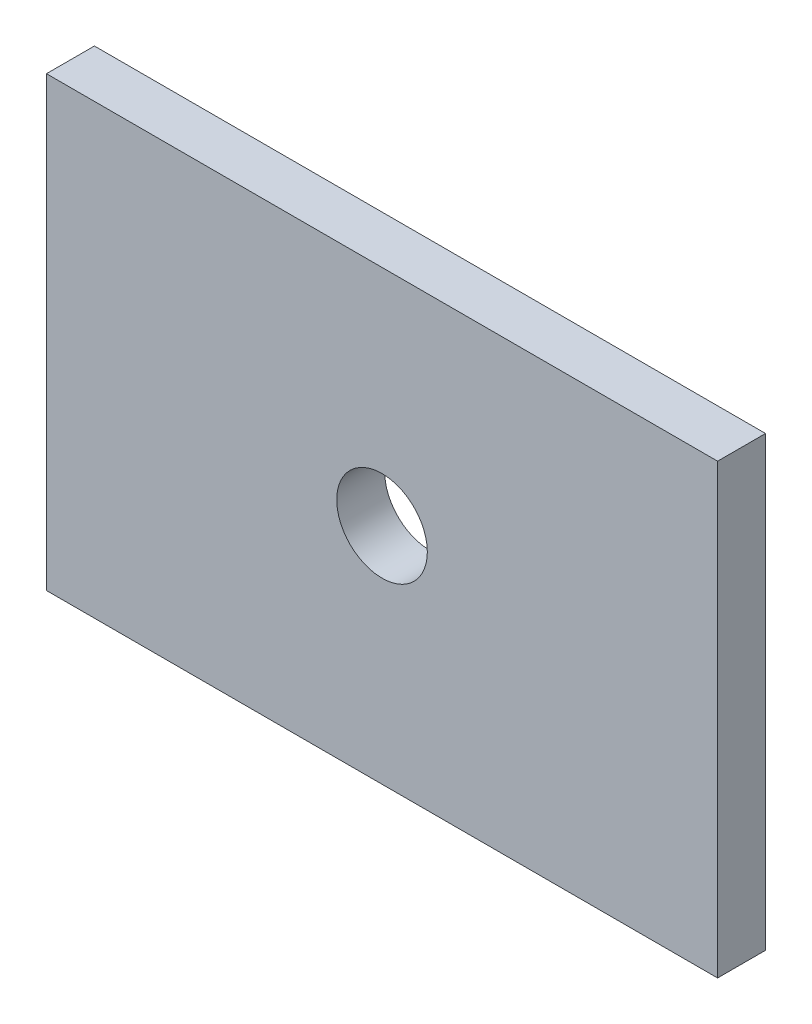
ISO-10303-21;
HEADER;
FILE_DESCRIPTION(('STEP AP214'),'2;1');
FILE_NAME('part.step','',(''),(''),'','','');
FILE_SCHEMA(('AUTOMOTIVE_DESIGN { 1 0 10303 214 1 1 1 1 }'));
ENDSEC;
DATA;
#1=APPLICATION_CONTEXT('core data for automotive mechanical design processes');
#2=APPLICATION_PROTOCOL_DEFINITION('international standard','automotive_design',2000,#1);
#3=PRODUCT_CONTEXT('',#1,'mechanical');
#4=PRODUCT('Part','Part','',(#3));
#5=PRODUCT_RELATED_PRODUCT_CATEGORY('part','',(#4));
#6=PRODUCT_DEFINITION_FORMATION('','',#4);
#7=PRODUCT_DEFINITION_CONTEXT('part definition',#1,'design');
#8=PRODUCT_DEFINITION('design','',#6,#7);
#9=PRODUCT_DEFINITION_SHAPE('','',#8);
#10=(LENGTH_UNIT() NAMED_UNIT(*) SI_UNIT(.MILLI.,.METRE.));
#11=(NAMED_UNIT(*) PLANE_ANGLE_UNIT() SI_UNIT($,.RADIAN.));
#12=(NAMED_UNIT(*) SI_UNIT($,.STERADIAN.) SOLID_ANGLE_UNIT());
#13=UNCERTAINTY_MEASURE_WITH_UNIT(LENGTH_MEASURE(1.E-05),#10,'distance_accuracy_value','');
#14=(GEOMETRIC_REPRESENTATION_CONTEXT(3) GLOBAL_UNCERTAINTY_ASSIGNED_CONTEXT((#13)) GLOBAL_UNIT_ASSIGNED_CONTEXT((#10,
#11,#12)) REPRESENTATION_CONTEXT('',''));
#15=CARTESIAN_POINT('',(0.,0.,0.));
#16=DIRECTION('',(0.,0.,1.));
#17=DIRECTION('',(1.,0.,0.));
#18=AXIS2_PLACEMENT_3D('',#15,#16,#17);
#19=CARTESIAN_POINT('',(0.,0.,4.7625));
#20=DIRECTION('',(1.,0.,0.));
#21=DIRECTION('',(0.,0.,-1.));
#22=AXIS2_PLACEMENT_3D('',#19,#20,#21);
#23=PLANE('',#22);
#24=DIRECTION('',(0.,-1.,0.));
#25=VECTOR('',#24,1.);
#26=CARTESIAN_POINT('',(0.,0.,0.));
#27=LINE('',#26,#25);
#28=CARTESIAN_POINT('',(0.,44.45,0.));
#29=VERTEX_POINT('',#28);
#30=CARTESIAN_POINT('',(0.,0.,0.));
#31=VERTEX_POINT('',#30);
#32=EDGE_CURVE('E98',#29,#31,#27,.T.);
#33=ORIENTED_EDGE('',*,*,#32,.T.);
#34=DIRECTION('',(0.,0.,-1.));
#35=VECTOR('',#34,1.);
#36=CARTESIAN_POINT('',(0.,0.,4.7625));
#37=LINE('',#36,#35);
#38=CARTESIAN_POINT('',(0.,0.,4.7625));
#39=VERTEX_POINT('',#38);
#40=EDGE_CURVE('E11',#39,#31,#37,.T.);
#41=ORIENTED_EDGE('',*,*,#40,.F.);
#42=DIRECTION('',(0.,-1.,0.));
#43=VECTOR('',#42,1.);
#44=CARTESIAN_POINT('',(0.,0.,4.7625));
#45=LINE('',#44,#43);
#46=CARTESIAN_POINT('',(0.,44.45,4.7625));
#47=VERTEX_POINT('',#46);
#48=EDGE_CURVE('E86',#47,#39,#45,.T.);
#49=ORIENTED_EDGE('',*,*,#48,.F.);
#50=DIRECTION('',(0.,0.,-1.));
#51=VECTOR('',#50,1.);
#52=CARTESIAN_POINT('',(0.,44.45,4.7625));
#53=LINE('',#52,#51);
#54=EDGE_CURVE('E94',#47,#29,#53,.T.);
#55=ORIENTED_EDGE('',*,*,#54,.T.);
#56=EDGE_LOOP('',(#33,#41,#49,#55));
#57=FACE_BOUND('',#56,.T.);
#58=ADVANCED_FACE('F35',(#57),#23,.F.);
#59=CARTESIAN_POINT('',(0.,0.,4.7625));
#60=DIRECTION('',(0.,1.,0.));
#61=DIRECTION('',(0.,0.,1.));
#62=AXIS2_PLACEMENT_3D('',#59,#60,#61);
#63=PLANE('',#62);
#64=DIRECTION('',(1.,0.,0.));
#65=VECTOR('',#64,1.);
#66=CARTESIAN_POINT('',(0.,0.,0.));
#67=LINE('',#66,#65);
#68=CARTESIAN_POINT('',(66.6496,0.,0.));
#69=VERTEX_POINT('',#68);
#70=EDGE_CURVE('E90',#31,#69,#67,.T.);
#71=ORIENTED_EDGE('',*,*,#70,.T.);
#72=DIRECTION('',(0.,0.,-1.));
#73=VECTOR('',#72,1.);
#74=CARTESIAN_POINT('',(66.6496,0.,4.7625));
#75=LINE('',#74,#73);
#76=CARTESIAN_POINT('',(66.6496,0.,4.7625));
#77=VERTEX_POINT('',#76);
#78=EDGE_CURVE('E43',#77,#69,#75,.T.);
#79=ORIENTED_EDGE('',*,*,#78,.F.);
#80=DIRECTION('',(1.,0.,0.));
#81=VECTOR('',#80,1.);
#82=CARTESIAN_POINT('',(0.,0.,4.7625));
#83=LINE('',#82,#81);
#84=EDGE_CURVE('E81',#39,#77,#83,.T.);
#85=ORIENTED_EDGE('',*,*,#84,.F.);
#86=ORIENTED_EDGE('',*,*,#40,.T.);
#87=EDGE_LOOP('',(#71,#79,#85,#86));
#88=FACE_BOUND('',#87,.T.);
#89=ADVANCED_FACE('F89',(#88),#63,.F.);
#90=CARTESIAN_POINT('',(66.6496,0.,4.7625));
#91=DIRECTION('',(-1.,0.,0.));
#92=DIRECTION('',(0.,0.,1.));
#93=AXIS2_PLACEMENT_3D('',#90,#91,#92);
#94=PLANE('',#93);
#95=DIRECTION('',(0.,1.,0.));
#96=VECTOR('',#95,1.);
#97=CARTESIAN_POINT('',(66.6496,0.,0.));
#98=LINE('',#97,#96);
#99=CARTESIAN_POINT('',(66.6496,44.45,0.));
#100=VERTEX_POINT('',#99);
#101=EDGE_CURVE('E68',#69,#100,#98,.T.);
#102=ORIENTED_EDGE('',*,*,#101,.T.);
#103=DIRECTION('',(0.,0.,-1.));
#104=VECTOR('',#103,1.);
#105=CARTESIAN_POINT('',(66.6496,44.45,4.7625));
#106=LINE('',#105,#104);
#107=CARTESIAN_POINT('',(66.6496,44.45,4.7625));
#108=VERTEX_POINT('',#107);
#109=EDGE_CURVE('E91',#108,#100,#106,.T.);
#110=ORIENTED_EDGE('',*,*,#109,.F.);
#111=DIRECTION('',(0.,1.,0.));
#112=VECTOR('',#111,1.);
#113=CARTESIAN_POINT('',(66.6496,0.,4.7625));
#114=LINE('',#113,#112);
#115=EDGE_CURVE('E84',#77,#108,#114,.T.);
#116=ORIENTED_EDGE('',*,*,#115,.F.);
#117=ORIENTED_EDGE('',*,*,#78,.T.);
#118=EDGE_LOOP('',(#102,#110,#116,#117));
#119=FACE_BOUND('',#118,.T.);
#120=ADVANCED_FACE('F92',(#119),#94,.F.);
#121=CARTESIAN_POINT('',(0.,44.45,4.7625));
#122=DIRECTION('',(0.,-1.,0.));
#123=DIRECTION('',(0.,0.,-1.));
#124=AXIS2_PLACEMENT_3D('',#121,#122,#123);
#125=PLANE('',#124);
#126=DIRECTION('',(-1.,0.,0.));
#127=VECTOR('',#126,1.);
#128=CARTESIAN_POINT('',(0.,44.45,0.));
#129=LINE('',#128,#127);
#130=EDGE_CURVE('E74',#100,#29,#129,.T.);
#131=ORIENTED_EDGE('',*,*,#130,.T.);
#132=ORIENTED_EDGE('',*,*,#54,.F.);
#133=DIRECTION('',(-1.,0.,0.));
#134=VECTOR('',#133,1.);
#135=CARTESIAN_POINT('',(0.,44.45,4.7625));
#136=LINE('',#135,#134);
#137=EDGE_CURVE('E51',#108,#47,#136,.T.);
#138=ORIENTED_EDGE('',*,*,#137,.F.);
#139=ORIENTED_EDGE('',*,*,#109,.T.);
#140=EDGE_LOOP('',(#131,#132,#138,#139));
#141=FACE_BOUND('',#140,.T.);
#142=ADVANCED_FACE('F106',(#141),#125,.F.);
#143=CARTESIAN_POINT('',(0.,0.,4.7625));
#144=DIRECTION('',(0.,0.,-1.));
#145=DIRECTION('',(-1.,0.,0.));
#146=AXIS2_PLACEMENT_3D('',#143,#144,#145);
#147=PLANE('',#146);
#148=CARTESIAN_POINT('',(33.3248,22.225,4.7625));
#149=DIRECTION('',(0.,0.,1.));
#150=DIRECTION('',(1.,0.,0.));
#151=AXIS2_PLACEMENT_3D('',#148,#149,#150);
#152=CIRCLE('',#151,4.5);
#153=CARTESIAN_POINT('',(37.8248,22.225,4.7625));
#154=VERTEX_POINT('',#153);
#155=EDGE_CURVE('E112',#154,#154,#152,.T.);
#156=ORIENTED_EDGE('',*,*,#155,.F.);
#157=EDGE_LOOP('',(#156));
#158=FACE_BOUND('',#157,.T.);
#159=ORIENTED_EDGE('',*,*,#48,.T.);
#160=ORIENTED_EDGE('',*,*,#84,.T.);
#161=ORIENTED_EDGE('',*,*,#115,.T.);
#162=ORIENTED_EDGE('',*,*,#137,.T.);
#163=EDGE_LOOP('',(#159,#160,#161,#162));
#164=FACE_BOUND('',#163,.T.);
#165=ADVANCED_FACE('F82',(#158,#164),#147,.F.);
#166=CARTESIAN_POINT('',(0.,0.,0.));
#167=DIRECTION('',(0.,0.,-1.));
#168=DIRECTION('',(-1.,0.,0.));
#169=AXIS2_PLACEMENT_3D('',#166,#167,#168);
#170=PLANE('',#169);
#171=CARTESIAN_POINT('',(33.3248,22.225,0.));
#172=DIRECTION('',(0.,0.,1.));
#173=DIRECTION('',(1.,0.,0.));
#174=AXIS2_PLACEMENT_3D('',#171,#172,#173);
#175=CIRCLE('',#174,4.5);
#176=CARTESIAN_POINT('',(37.8248,22.225,0.));
#177=VERTEX_POINT('',#176);
#178=EDGE_CURVE('E101',#177,#177,#175,.T.);
#179=ORIENTED_EDGE('',*,*,#178,.T.);
#180=EDGE_LOOP('',(#179));
#181=FACE_BOUND('',#180,.T.);
#182=ORIENTED_EDGE('',*,*,#32,.F.);
#183=ORIENTED_EDGE('',*,*,#130,.F.);
#184=ORIENTED_EDGE('',*,*,#101,.F.);
#185=ORIENTED_EDGE('',*,*,#70,.F.);
#186=EDGE_LOOP('',(#182,#183,#184,#185));
#187=FACE_BOUND('',#186,.T.);
#188=ADVANCED_FACE('F109',(#181,#187),#170,.T.);
#189=CARTESIAN_POINT('',(33.3248,22.225,0.));
#190=DIRECTION('',(0.,0.,1.));
#191=DIRECTION('',(1.,0.,0.));
#192=AXIS2_PLACEMENT_3D('',#189,#190,#191);
#193=CYLINDRICAL_SURFACE('',#192,4.5);
#194=CARTESIAN_POINT('',(37.8248,22.225,0.));
#195=CARTESIAN_POINT('',(37.8248,22.225,0.049609375));
#196=CARTESIAN_POINT('',(37.8248,22.225,0.09921875));
#197=CARTESIAN_POINT('',(37.8248,22.225,0.1984375));
#198=CARTESIAN_POINT('',(37.8248,22.225,0.248046875));
#199=CARTESIAN_POINT('',(37.8248,22.225,0.347265625));
#200=CARTESIAN_POINT('',(37.8248,22.225,0.396875));
#201=CARTESIAN_POINT('',(37.8248,22.225,0.49609375));
#202=CARTESIAN_POINT('',(37.8248,22.225,0.545703125));
#203=CARTESIAN_POINT('',(37.8248,22.225,0.644921875));
#204=CARTESIAN_POINT('',(37.8248,22.225,0.69453125));
#205=CARTESIAN_POINT('',(37.8248,22.225,0.79375));
#206=CARTESIAN_POINT('',(37.8248,22.225,0.843359375));
#207=CARTESIAN_POINT('',(37.8248,22.225,0.942578125));
#208=CARTESIAN_POINT('',(37.8248,22.225,0.9921875));
#209=CARTESIAN_POINT('',(37.8248,22.225,1.09140625));
#210=CARTESIAN_POINT('',(37.8248,22.225,1.141015625));
#211=CARTESIAN_POINT('',(37.8248,22.225,1.240234375));
#212=CARTESIAN_POINT('',(37.8248,22.225,1.28984375));
#213=CARTESIAN_POINT('',(37.8248,22.225,1.3890625));
#214=CARTESIAN_POINT('',(37.8248,22.225,1.438671875));
#215=CARTESIAN_POINT('',(37.8248,22.225,1.537890625));
#216=CARTESIAN_POINT('',(37.8248,22.225,1.5875));
#217=CARTESIAN_POINT('',(37.8248,22.225,1.68671875));
#218=CARTESIAN_POINT('',(37.8248,22.225,1.736328125));
#219=CARTESIAN_POINT('',(37.8248,22.225,1.835546875));
#220=CARTESIAN_POINT('',(37.8248,22.225,1.88515625));
#221=CARTESIAN_POINT('',(37.8248,22.225,1.984375));
#222=CARTESIAN_POINT('',(37.8248,22.225,2.033984375));
#223=CARTESIAN_POINT('',(37.8248,22.225,2.133203125));
#224=CARTESIAN_POINT('',(37.8248,22.225,2.1828125));
#225=CARTESIAN_POINT('',(37.8248,22.225,2.28203125));
#226=CARTESIAN_POINT('',(37.8248,22.225,2.331640625));
#227=CARTESIAN_POINT('',(37.8248,22.225,2.430859375));
#228=CARTESIAN_POINT('',(37.8248,22.225,2.48046875));
#229=CARTESIAN_POINT('',(37.8248,22.225,2.5796875));
#230=CARTESIAN_POINT('',(37.8248,22.225,2.629296875));
#231=CARTESIAN_POINT('',(37.8248,22.225,2.728515625));
#232=CARTESIAN_POINT('',(37.8248,22.225,2.778125));
#233=CARTESIAN_POINT('',(37.8248,22.225,2.87734375));
#234=CARTESIAN_POINT('',(37.8248,22.225,2.926953125));
#235=CARTESIAN_POINT('',(37.8248,22.225,3.026171875));
#236=CARTESIAN_POINT('',(37.8248,22.225,3.07578125));
#237=CARTESIAN_POINT('',(37.8248,22.225,3.175));
#238=CARTESIAN_POINT('',(37.8248,22.225,3.224609375));
#239=CARTESIAN_POINT('',(37.8248,22.225,3.323828125));
#240=CARTESIAN_POINT('',(37.8248,22.225,3.3734375));
#241=CARTESIAN_POINT('',(37.8248,22.225,3.47265625));
#242=CARTESIAN_POINT('',(37.8248,22.225,3.522265625));
#243=CARTESIAN_POINT('',(37.8248,22.225,3.621484375));
#244=CARTESIAN_POINT('',(37.8248,22.225,3.67109375));
#245=CARTESIAN_POINT('',(37.8248,22.225,3.7703125));
#246=CARTESIAN_POINT('',(37.8248,22.225,3.819921875));
#247=CARTESIAN_POINT('',(37.8248,22.225,3.919140625));
#248=CARTESIAN_POINT('',(37.8248,22.225,3.96875));
#249=CARTESIAN_POINT('',(37.8248,22.225,4.06796875));
#250=CARTESIAN_POINT('',(37.8248,22.225,4.117578125));
#251=CARTESIAN_POINT('',(37.8248,22.225,4.216796875));
#252=CARTESIAN_POINT('',(37.8248,22.225,4.26640625));
#253=CARTESIAN_POINT('',(37.8248,22.225,4.365625));
#254=CARTESIAN_POINT('',(37.8248,22.225,4.415234375));
#255=CARTESIAN_POINT('',(37.8248,22.225,4.514453125));
#256=CARTESIAN_POINT('',(37.8248,22.225,4.5640625));
#257=CARTESIAN_POINT('',(37.8248,22.225,4.66328125));
#258=CARTESIAN_POINT('',(37.8248,22.225,4.712890625));
#259=CARTESIAN_POINT('',(37.8248,22.225,4.7625));
#260=B_SPLINE_CURVE_WITH_KNOTS('',3,(#194,#195,#196,#197,#198,#199,#200,#201,#202,#203,#204,
#205,#206,#207,#208,#209,#210,#211,#212,#213,#214,#215,#216,#217,#218,#219,#220,#221,#222,#223,
#224,#225,#226,#227,#228,#229,#230,#231,#232,#233,#234,#235,#236,#237,#238,#239,#240,#241,#242,
#243,#244,#245,#246,#247,#248,#249,#250,#251,#252,#253,#254,#255,#256,#257,#258,#259),
.UNSPECIFIED.,.F.,.F.,(4,2,2,2,2,2,2,2,2,2,2,2,2,2,2,2,2,2,2,2,2,2,2,2,2,2,2,2,2,2,2,2,4),(0.,
0.148828125,0.29765625,0.446484375,0.5953125,0.744140625,0.89296875,1.041796875,1.190625,
1.339453125,1.48828125,1.637109375,1.7859375,1.934765625,2.08359375,2.232421875,2.38125,
2.530078125,2.67890625,2.827734375,2.9765625,3.125390625,3.27421875,3.423046875,3.571875,
3.720703125,3.86953125,4.018359375,4.1671875,4.316015625,4.46484375,4.613671875,4.7625),.UNSPECIFIED.);
#261=EDGE_CURVE('BSEAM119',#177,#154,#260,.T.);
#262=ORIENTED_EDGE('',*,*,#178,.F.);
#263=ORIENTED_EDGE('',*,*,#155,.T.);
#264=ORIENTED_EDGE('',*,*,#261,.T.);
#265=ORIENTED_EDGE('',*,*,#261,.F.);
#266=EDGE_LOOP('',(#262,#264,#263,#265));
#267=FACE_BOUND('',#266,.T.);
#268=ADVANCED_FACE('F119',(#267),#193,.F.);
#269=CLOSED_SHELL('',(#58,#89,#120,#142,#165,#188,#268));
#270=MANIFOLD_SOLID_BREP('B2',#269);
#271=ADVANCED_BREP_SHAPE_REPRESENTATION('',(#18,#270),#14);
#272=SHAPE_DEFINITION_REPRESENTATION(#9,#271);
ENDSEC;
END-ISO-10303-21;
